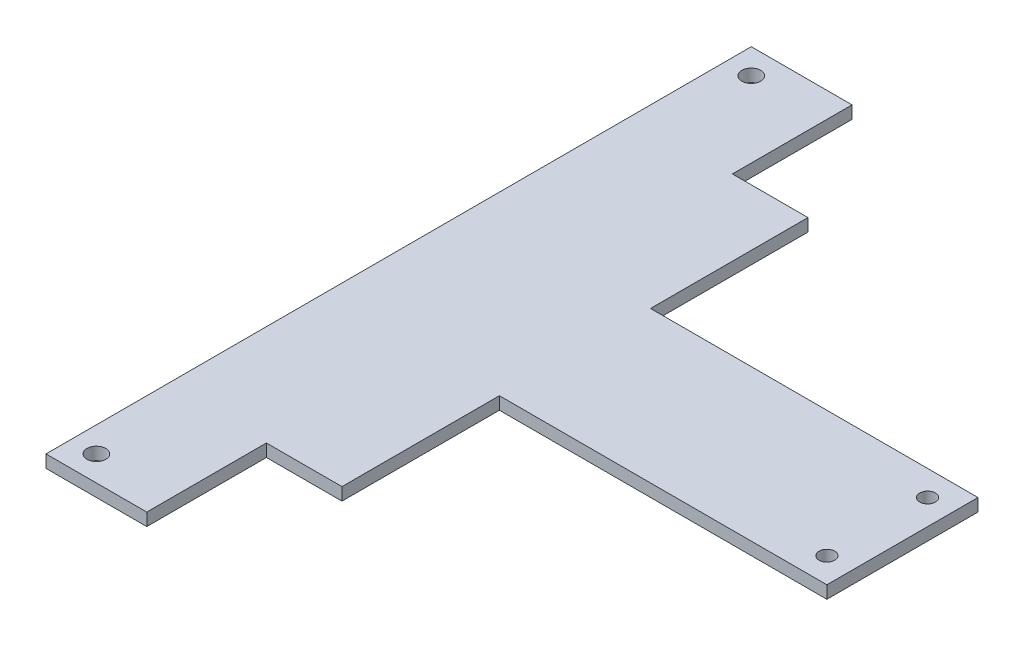
ISO-10303-21;
HEADER;
FILE_DESCRIPTION(('STEP AP214'),'2;1');
FILE_NAME('part.step','',(''),(''),'','','');
FILE_SCHEMA(('AUTOMOTIVE_DESIGN { 1 0 10303 214 1 1 1 1 }'));
ENDSEC;
DATA;
#1=APPLICATION_CONTEXT('core data for automotive mechanical design processes');
#2=APPLICATION_PROTOCOL_DEFINITION('international standard','automotive_design',2000,#1);
#3=PRODUCT_CONTEXT('',#1,'mechanical');
#4=PRODUCT('Part','Part','',(#3));
#5=PRODUCT_RELATED_PRODUCT_CATEGORY('part','',(#4));
#6=PRODUCT_DEFINITION_FORMATION('','',#4);
#7=PRODUCT_DEFINITION_CONTEXT('part definition',#1,'design');
#8=PRODUCT_DEFINITION('design','',#6,#7);
#9=PRODUCT_DEFINITION_SHAPE('','',#8);
#10=(LENGTH_UNIT() NAMED_UNIT(*) SI_UNIT(.MILLI.,.METRE.));
#11=(NAMED_UNIT(*) PLANE_ANGLE_UNIT() SI_UNIT($,.RADIAN.));
#12=(NAMED_UNIT(*) SI_UNIT($,.STERADIAN.) SOLID_ANGLE_UNIT());
#13=UNCERTAINTY_MEASURE_WITH_UNIT(LENGTH_MEASURE(1.E-05),#10,'distance_accuracy_value','');
#14=(GEOMETRIC_REPRESENTATION_CONTEXT(3) GLOBAL_UNCERTAINTY_ASSIGNED_CONTEXT((#13)) GLOBAL_UNIT_ASSIGNED_CONTEXT((#10,
#11,#12)) REPRESENTATION_CONTEXT('',''));
#15=CARTESIAN_POINT('',(0.,0.,0.));
#16=DIRECTION('',(0.,0.,1.));
#17=DIRECTION('',(1.,0.,0.));
#18=AXIS2_PLACEMENT_3D('',#15,#16,#17);
#19=CARTESIAN_POINT('',(203.2,3.175,0.));
#20=DIRECTION('',(-1.,0.,0.));
#21=DIRECTION('',(0.,0.,1.));
#22=AXIS2_PLACEMENT_3D('',#19,#20,#21);
#23=PLANE('',#22);
#24=DIRECTION('',(0.,0.,-1.));
#25=VECTOR('',#24,1.);
#26=CARTESIAN_POINT('',(203.2,-3.175,0.));
#27=LINE('',#26,#25);
#28=CARTESIAN_POINT('',(203.2,-3.175,38.1));
#29=VERTEX_POINT('',#28);
#30=CARTESIAN_POINT('',(203.2,-3.175,-38.1));
#31=VERTEX_POINT('',#30);
#32=EDGE_CURVE('E160',#29,#31,#27,.T.);
#33=ORIENTED_EDGE('',*,*,#32,.T.);
#34=DIRECTION('',(0.,-1.,0.));
#35=VECTOR('',#34,1.);
#36=CARTESIAN_POINT('',(203.2,3.175,-38.1));
#37=LINE('',#36,#35);
#38=CARTESIAN_POINT('',(203.2,3.175,-38.1));
#39=VERTEX_POINT('',#38);
#40=EDGE_CURVE('E11',#39,#31,#37,.T.);
#41=ORIENTED_EDGE('',*,*,#40,.F.);
#42=DIRECTION('',(0.,0.,-1.));
#43=VECTOR('',#42,1.);
#44=CARTESIAN_POINT('',(203.2,3.175,0.));
#45=LINE('',#44,#43);
#46=CARTESIAN_POINT('',(203.2,3.175,38.1));
#47=VERTEX_POINT('',#46);
#48=EDGE_CURVE('E178',#47,#39,#45,.T.);
#49=ORIENTED_EDGE('',*,*,#48,.F.);
#50=DIRECTION('',(0.,-1.,0.));
#51=VECTOR('',#50,1.);
#52=CARTESIAN_POINT('',(203.2,3.175,38.1));
#53=LINE('',#52,#51);
#54=EDGE_CURVE('E154',#47,#29,#53,.T.);
#55=ORIENTED_EDGE('',*,*,#54,.T.);
#56=EDGE_LOOP('',(#33,#41,#49,#55));
#57=FACE_BOUND('',#56,.T.);
#58=ADVANCED_FACE('F35',(#57),#23,.F.);
#59=CARTESIAN_POINT('',(0.,3.175,-38.1));
#60=DIRECTION('',(0.,0.,1.));
#61=DIRECTION('',(1.,0.,0.));
#62=AXIS2_PLACEMENT_3D('',#59,#60,#61);
#63=PLANE('',#62);
#64=DIRECTION('',(-1.,0.,0.));
#65=VECTOR('',#64,1.);
#66=CARTESIAN_POINT('',(0.,-3.175,-38.1));
#67=LINE('',#66,#65);
#68=CARTESIAN_POINT('',(38.1,-3.175,-38.1));
#69=VERTEX_POINT('',#68);
#70=EDGE_CURVE('E163',#31,#69,#67,.T.);
#71=ORIENTED_EDGE('',*,*,#70,.T.);
#72=DIRECTION('',(0.,-1.,0.));
#73=VECTOR('',#72,1.);
#74=CARTESIAN_POINT('',(38.1,3.175,-38.1));
#75=LINE('',#74,#73);
#76=CARTESIAN_POINT('',(38.1,3.175,-38.1));
#77=VERTEX_POINT('',#76);
#78=EDGE_CURVE('E42',#77,#69,#75,.T.);
#79=ORIENTED_EDGE('',*,*,#78,.F.);
#80=DIRECTION('',(-1.,0.,0.));
#81=VECTOR('',#80,1.);
#82=CARTESIAN_POINT('',(0.,3.175,-38.1));
#83=LINE('',#82,#81);
#84=EDGE_CURVE('E253',#39,#77,#83,.T.);
#85=ORIENTED_EDGE('',*,*,#84,.F.);
#86=ORIENTED_EDGE('',*,*,#40,.T.);
#87=EDGE_LOOP('',(#71,#79,#85,#86));
#88=FACE_BOUND('',#87,.T.);
#89=ADVANCED_FACE('F190',(#88),#63,.F.);
#90=CARTESIAN_POINT('',(38.1,3.175,0.));
#91=DIRECTION('',(1.,0.,0.));
#92=DIRECTION('',(0.,0.,-1.));
#93=AXIS2_PLACEMENT_3D('',#90,#91,#92);
#94=PLANE('',#93);
#95=DIRECTION('',(0.,-1.,0.));
#96=VECTOR('',#95,1.);
#97=CARTESIAN_POINT('',(38.1000000000001,3.176,-117.475));
#98=LINE('',#97,#96);
#99=CARTESIAN_POINT('',(38.1,3.175,-117.475));
#100=VERTEX_POINT('',#99);
#101=CARTESIAN_POINT('',(38.1,-3.175,-117.475));
#102=VERTEX_POINT('',#101);
#103=EDGE_CURVE('E49',#100,#102,#98,.T.);
#104=ORIENTED_EDGE('',*,*,#103,.F.);
#105=DIRECTION('',(0.,0.,1.));
#106=VECTOR('',#105,1.);
#107=CARTESIAN_POINT('',(38.1,3.175,0.));
#108=LINE('',#107,#106);
#109=EDGE_CURVE('E187',#100,#77,#108,.T.);
#110=ORIENTED_EDGE('',*,*,#109,.T.);
#111=ORIENTED_EDGE('',*,*,#78,.T.);
#112=DIRECTION('',(0.,0.,1.));
#113=VECTOR('',#112,1.);
#114=CARTESIAN_POINT('',(38.1,-3.175,0.));
#115=LINE('',#114,#113);
#116=EDGE_CURVE('E167',#102,#69,#115,.T.);
#117=ORIENTED_EDGE('',*,*,#116,.F.);
#118=EDGE_LOOP('',(#104,#110,#111,#117));
#119=FACE_BOUND('',#118,.T.);
#120=ADVANCED_FACE('F185',(#119),#94,.T.);
#121=CARTESIAN_POINT('',(1.29526019539602E-13,3.175,-177.8));
#122=DIRECTION('',(0.,0.,-1.));
#123=DIRECTION('',(-1.,0.,0.));
#124=AXIS2_PLACEMENT_3D('',#121,#122,#123);
#125=PLANE('',#124);
#126=DIRECTION('',(0.,-1.,0.));
#127=VECTOR('',#126,1.);
#128=CARTESIAN_POINT('',(0.,3.176,-177.8));
#129=LINE('',#128,#127);
#130=CARTESIAN_POINT('',(0.,3.175,-177.8));
#131=VERTEX_POINT('',#130);
#132=CARTESIAN_POINT('',(0.,-3.175,-177.8));
#133=VERTEX_POINT('',#132);
#134=EDGE_CURVE('E208',#131,#133,#129,.T.);
#135=ORIENTED_EDGE('',*,*,#134,.T.);
#136=DIRECTION('',(1.,0.,0.));
#137=VECTOR('',#136,1.);
#138=CARTESIAN_POINT('',(1.29526019539602E-13,-3.175,-177.8));
#139=LINE('',#138,#137);
#140=CARTESIAN_POINT('',(-50.8,-3.175,-177.8));
#141=VERTEX_POINT('',#140);
#142=EDGE_CURVE('E169',#141,#133,#139,.T.);
#143=ORIENTED_EDGE('',*,*,#142,.F.);
#144=DIRECTION('',(0.,-1.,0.));
#145=VECTOR('',#144,1.);
#146=CARTESIAN_POINT('',(-50.8,3.175,-177.8));
#147=LINE('',#146,#145);
#148=CARTESIAN_POINT('',(-50.8,3.175,-177.8));
#149=VERTEX_POINT('',#148);
#150=EDGE_CURVE('E235',#149,#141,#147,.T.);
#151=ORIENTED_EDGE('',*,*,#150,.F.);
#152=DIRECTION('',(1.,0.,0.));
#153=VECTOR('',#152,1.);
#154=CARTESIAN_POINT('',(1.29526019539602E-13,3.175,-177.8));
#155=LINE('',#154,#153);
#156=EDGE_CURVE('E156',#149,#131,#155,.T.);
#157=ORIENTED_EDGE('',*,*,#156,.T.);
#158=EDGE_LOOP('',(#135,#143,#151,#157));
#159=FACE_BOUND('',#158,.T.);
#160=ADVANCED_FACE('F258',(#159),#125,.T.);
#161=CARTESIAN_POINT('',(1.29526019539602E-13,3.175,177.8));
#162=DIRECTION('',(0.,0.,1.));
#163=DIRECTION('',(1.,0.,0.));
#164=AXIS2_PLACEMENT_3D('',#161,#162,#163);
#165=PLANE('',#164);
#166=DIRECTION('',(0.,-1.,0.));
#167=VECTOR('',#166,1.);
#168=CARTESIAN_POINT('',(0.,3.176,177.8));
#169=LINE('',#168,#167);
#170=CARTESIAN_POINT('',(0.,3.175,177.8));
#171=VERTEX_POINT('',#170);
#172=CARTESIAN_POINT('',(0.,-3.175,177.8));
#173=VERTEX_POINT('',#172);
#174=EDGE_CURVE('E57',#171,#173,#169,.T.);
#175=ORIENTED_EDGE('',*,*,#174,.F.);
#176=DIRECTION('',(-1.,0.,0.));
#177=VECTOR('',#176,1.);
#178=CARTESIAN_POINT('',(1.29526019539602E-13,3.175,177.8));
#179=LINE('',#178,#177);
#180=CARTESIAN_POINT('',(-50.8,3.175,177.8));
#181=VERTEX_POINT('',#180);
#182=EDGE_CURVE('E152',#171,#181,#179,.T.);
#183=ORIENTED_EDGE('',*,*,#182,.T.);
#184=DIRECTION('',(0.,-1.,0.));
#185=VECTOR('',#184,1.);
#186=CARTESIAN_POINT('',(-50.8,3.175,177.8));
#187=LINE('',#186,#185);
#188=CARTESIAN_POINT('',(-50.8,-3.175,177.8));
#189=VERTEX_POINT('',#188);
#190=EDGE_CURVE('E232',#181,#189,#187,.T.);
#191=ORIENTED_EDGE('',*,*,#190,.T.);
#192=DIRECTION('',(-1.,0.,0.));
#193=VECTOR('',#192,1.);
#194=CARTESIAN_POINT('',(1.29526019539602E-13,-3.175,177.8));
#195=LINE('',#194,#193);
#196=EDGE_CURVE('E172',#173,#189,#195,.T.);
#197=ORIENTED_EDGE('',*,*,#196,.F.);
#198=EDGE_LOOP('',(#175,#183,#191,#197));
#199=FACE_BOUND('',#198,.T.);
#200=ADVANCED_FACE('F291',(#199),#165,.T.);
#201=CARTESIAN_POINT('',(38.1,3.175,0.));
#202=DIRECTION('',(1.,0.,0.));
#203=DIRECTION('',(0.,0.,-1.));
#204=AXIS2_PLACEMENT_3D('',#201,#202,#203);
#205=PLANE('',#204);
#206=DIRECTION('',(0.,-1.,0.));
#207=VECTOR('',#206,1.);
#208=CARTESIAN_POINT('',(38.1,3.176,117.475));
#209=LINE('',#208,#207);
#210=CARTESIAN_POINT('',(38.1,3.175,117.475));
#211=VERTEX_POINT('',#210);
#212=CARTESIAN_POINT('',(38.1,-3.175,117.475));
#213=VERTEX_POINT('',#212);
#214=EDGE_CURVE('E124',#211,#213,#209,.T.);
#215=ORIENTED_EDGE('',*,*,#214,.T.);
#216=DIRECTION('',(0.,0.,1.));
#217=VECTOR('',#216,1.);
#218=CARTESIAN_POINT('',(38.1,-3.175,0.));
#219=LINE('',#218,#217);
#220=CARTESIAN_POINT('',(38.1,-3.175,38.1));
#221=VERTEX_POINT('',#220);
#222=EDGE_CURVE('E174',#221,#213,#219,.T.);
#223=ORIENTED_EDGE('',*,*,#222,.F.);
#224=DIRECTION('',(0.,-1.,0.));
#225=VECTOR('',#224,1.);
#226=CARTESIAN_POINT('',(38.1,3.175,38.1));
#227=LINE('',#226,#225);
#228=CARTESIAN_POINT('',(38.1,3.175,38.1));
#229=VERTEX_POINT('',#228);
#230=EDGE_CURVE('E149',#229,#221,#227,.T.);
#231=ORIENTED_EDGE('',*,*,#230,.F.);
#232=DIRECTION('',(0.,0.,1.));
#233=VECTOR('',#232,1.);
#234=CARTESIAN_POINT('',(38.1,3.175,0.));
#235=LINE('',#234,#233);
#236=EDGE_CURVE('E143',#229,#211,#235,.T.);
#237=ORIENTED_EDGE('',*,*,#236,.T.);
#238=EDGE_LOOP('',(#215,#223,#231,#237));
#239=FACE_BOUND('',#238,.T.);
#240=ADVANCED_FACE('F148',(#239),#205,.T.);
#241=CARTESIAN_POINT('',(0.,3.175,38.1));
#242=DIRECTION('',(0.,0.,-1.));
#243=DIRECTION('',(-1.,0.,0.));
#244=AXIS2_PLACEMENT_3D('',#241,#242,#243);
#245=PLANE('',#244);
#246=DIRECTION('',(1.,0.,0.));
#247=VECTOR('',#246,1.);
#248=CARTESIAN_POINT('',(0.,-3.175,38.1));
#249=LINE('',#248,#247);
#250=EDGE_CURVE('E176',#221,#29,#249,.T.);
#251=ORIENTED_EDGE('',*,*,#250,.T.);
#252=ORIENTED_EDGE('',*,*,#54,.F.);
#253=DIRECTION('',(1.,0.,0.));
#254=VECTOR('',#253,1.);
#255=CARTESIAN_POINT('',(0.,3.175,38.1));
#256=LINE('',#255,#254);
#257=EDGE_CURVE('E151',#229,#47,#256,.T.);
#258=ORIENTED_EDGE('',*,*,#257,.F.);
#259=ORIENTED_EDGE('',*,*,#230,.T.);
#260=EDGE_LOOP('',(#251,#252,#258,#259));
#261=FACE_BOUND('',#260,.T.);
#262=ADVANCED_FACE('F267',(#261),#245,.F.);
#263=CARTESIAN_POINT('',(0.,3.175,0.));
#264=DIRECTION('',(0.,1.,0.));
#265=DIRECTION('',(0.,0.,1.));
#266=AXIS2_PLACEMENT_3D('',#263,#264,#265);
#267=PLANE('',#266);
#268=DIRECTION('',(1.,0.,0.));
#269=VECTOR('',#268,1.);
#270=CARTESIAN_POINT('',(38.1,3.175,117.475));
#271=LINE('',#270,#269);
#272=CARTESIAN_POINT('',(0.,3.175,117.475));
#273=VERTEX_POINT('',#272);
#274=EDGE_CURVE('E127',#273,#211,#271,.T.);
#275=ORIENTED_EDGE('',*,*,#274,.T.);
#276=ORIENTED_EDGE('',*,*,#236,.F.);
#277=ORIENTED_EDGE('',*,*,#257,.T.);
#278=ORIENTED_EDGE('',*,*,#48,.T.);
#279=ORIENTED_EDGE('',*,*,#84,.T.);
#280=ORIENTED_EDGE('',*,*,#109,.F.);
#281=DIRECTION('',(-1.,0.,0.));
#282=VECTOR('',#281,1.);
#283=CARTESIAN_POINT('',(38.1000000000001,3.175,-117.475));
#284=LINE('',#283,#282);
#285=CARTESIAN_POINT('',(0.,3.175,-117.475));
#286=VERTEX_POINT('',#285);
#287=EDGE_CURVE('E211',#100,#286,#284,.T.);
#288=ORIENTED_EDGE('',*,*,#287,.T.);
#289=DIRECTION('',(0.,0.,-1.));
#290=VECTOR('',#289,1.);
#291=CARTESIAN_POINT('',(0.,3.175,-177.8));
#292=LINE('',#291,#290);
#293=EDGE_CURVE('E201',#286,#131,#292,.T.);
#294=ORIENTED_EDGE('',*,*,#293,.T.);
#295=ORIENTED_EDGE('',*,*,#156,.F.);
#296=DIRECTION('',(0.,0.,-1.));
#297=VECTOR('',#296,1.);
#298=CARTESIAN_POINT('',(-50.8,3.175,177.8));
#299=LINE('',#298,#297);
#300=EDGE_CURVE('E229',#181,#149,#299,.T.);
#301=ORIENTED_EDGE('',*,*,#300,.F.);
#302=ORIENTED_EDGE('',*,*,#182,.F.);
#303=DIRECTION('',(0.,0.,-1.));
#304=VECTOR('',#303,1.);
#305=CARTESIAN_POINT('',(0.,3.175,177.8));
#306=LINE('',#305,#304);
#307=EDGE_CURVE('E145',#171,#273,#306,.T.);
#308=ORIENTED_EDGE('',*,*,#307,.T.);
#309=EDGE_LOOP('',(#275,#276,#277,#278,#279,#280,#288,#294,#295,#301,#302,#308));
#310=FACE_BOUND('',#309,.T.);
#311=CARTESIAN_POINT('',(190.5,3.175,-25.4));
#312=DIRECTION('',(0.,1.,0.));
#313=DIRECTION('',(0.,0.,1.));
#314=AXIS2_PLACEMENT_3D('',#311,#312,#313);
#315=CIRCLE('',#314,3.96874999999999);
#316=CARTESIAN_POINT('',(190.5,3.175,-21.43125));
#317=VERTEX_POINT('',#316);
#318=EDGE_CURVE('E238',#317,#317,#315,.T.);
#319=ORIENTED_EDGE('',*,*,#318,.F.);
#320=EDGE_LOOP('',(#319));
#321=FACE_BOUND('',#320,.T.);
#322=CARTESIAN_POINT('',(190.5,3.175,25.4));
#323=DIRECTION('',(0.,1.,0.));
#324=DIRECTION('',(0.,0.,1.));
#325=AXIS2_PLACEMENT_3D('',#322,#323,#324);
#326=CIRCLE('',#325,3.96874999999999);
#327=CARTESIAN_POINT('',(190.5,3.175,29.36875));
#328=VERTEX_POINT('',#327);
#329=EDGE_CURVE('E246',#328,#328,#326,.T.);
#330=ORIENTED_EDGE('',*,*,#329,.F.);
#331=EDGE_LOOP('',(#330));
#332=FACE_BOUND('',#331,.T.);
#333=CARTESIAN_POINT('',(-38.1,3.175,165.1));
#334=DIRECTION('',(0.,-1.,0.));
#335=DIRECTION('',(0.,0.,-1.));
#336=AXIS2_PLACEMENT_3D('',#333,#334,#335);
#337=CIRCLE('',#336,4.7625);
#338=CARTESIAN_POINT('',(-38.1,3.175,160.3375));
#339=VERTEX_POINT('',#338);
#340=EDGE_CURVE('E217',#339,#339,#337,.T.);
#341=ORIENTED_EDGE('',*,*,#340,.T.);
#342=EDGE_LOOP('',(#341));
#343=FACE_BOUND('',#342,.T.);
#344=CARTESIAN_POINT('',(-38.1,3.175,-165.1));
#345=DIRECTION('',(0.,-1.,0.));
#346=DIRECTION('',(0.,0.,-1.));
#347=AXIS2_PLACEMENT_3D('',#344,#345,#346);
#348=CIRCLE('',#347,4.7625);
#349=CARTESIAN_POINT('',(-38.1,3.175,-169.8625));
#350=VERTEX_POINT('',#349);
#351=EDGE_CURVE('E223',#350,#350,#348,.T.);
#352=ORIENTED_EDGE('',*,*,#351,.T.);
#353=EDGE_LOOP('',(#352));
#354=FACE_BOUND('',#353,.T.);
#355=ADVANCED_FACE('F141',(#310,#321,#332,#343,#354),#267,.T.);
#356=CARTESIAN_POINT('',(0.,-3.175,0.));
#357=DIRECTION('',(0.,1.,0.));
#358=DIRECTION('',(0.,0.,1.));
#359=AXIS2_PLACEMENT_3D('',#356,#357,#358);
#360=PLANE('',#359);
#361=CARTESIAN_POINT('',(190.5,-3.175,-25.4));
#362=DIRECTION('',(0.,1.,0.));
#363=DIRECTION('',(0.,0.,1.));
#364=AXIS2_PLACEMENT_3D('',#361,#362,#363);
#365=CIRCLE('',#364,3.96874999999999);
#366=CARTESIAN_POINT('',(190.5,-3.175,-21.43125));
#367=VERTEX_POINT('',#366);
#368=EDGE_CURVE('E243',#367,#367,#365,.T.);
#369=ORIENTED_EDGE('',*,*,#368,.T.);
#370=EDGE_LOOP('',(#369));
#371=FACE_BOUND('',#370,.T.);
#372=CARTESIAN_POINT('',(190.5,-3.175,25.4));
#373=DIRECTION('',(0.,1.,0.));
#374=DIRECTION('',(0.,0.,1.));
#375=AXIS2_PLACEMENT_3D('',#372,#373,#374);
#376=CIRCLE('',#375,3.96874999999999);
#377=CARTESIAN_POINT('',(190.5,-3.175,29.36875));
#378=VERTEX_POINT('',#377);
#379=EDGE_CURVE('E164',#378,#378,#376,.T.);
#380=ORIENTED_EDGE('',*,*,#379,.T.);
#381=EDGE_LOOP('',(#380));
#382=FACE_BOUND('',#381,.T.);
#383=ORIENTED_EDGE('',*,*,#222,.T.);
#384=DIRECTION('',(1.,0.,0.));
#385=VECTOR('',#384,1.);
#386=CARTESIAN_POINT('',(38.1,-3.175,117.475));
#387=LINE('',#386,#385);
#388=CARTESIAN_POINT('',(0.,-3.175,117.475));
#389=VERTEX_POINT('',#388);
#390=EDGE_CURVE('E130',#389,#213,#387,.T.);
#391=ORIENTED_EDGE('',*,*,#390,.F.);
#392=DIRECTION('',(0.,0.,-1.));
#393=VECTOR('',#392,1.);
#394=CARTESIAN_POINT('',(0.,-3.175,177.8));
#395=LINE('',#394,#393);
#396=EDGE_CURVE('E146',#173,#389,#395,.T.);
#397=ORIENTED_EDGE('',*,*,#396,.F.);
#398=ORIENTED_EDGE('',*,*,#196,.T.);
#399=DIRECTION('',(0.,0.,-1.));
#400=VECTOR('',#399,1.);
#401=CARTESIAN_POINT('',(-50.8,-3.175,177.8));
#402=LINE('',#401,#400);
#403=EDGE_CURVE('E226',#189,#141,#402,.T.);
#404=ORIENTED_EDGE('',*,*,#403,.T.);
#405=ORIENTED_EDGE('',*,*,#142,.T.);
#406=DIRECTION('',(0.,0.,-1.));
#407=VECTOR('',#406,1.);
#408=CARTESIAN_POINT('',(0.,-3.175,-177.8));
#409=LINE('',#408,#407);
#410=CARTESIAN_POINT('',(0.,-3.175,-117.475));
#411=VERTEX_POINT('',#410);
#412=EDGE_CURVE('E199',#411,#133,#409,.T.);
#413=ORIENTED_EDGE('',*,*,#412,.F.);
#414=DIRECTION('',(-1.,0.,0.));
#415=VECTOR('',#414,1.);
#416=CARTESIAN_POINT('',(38.1000000000001,-3.175,-117.475));
#417=LINE('',#416,#415);
#418=EDGE_CURVE('E198',#102,#411,#417,.T.);
#419=ORIENTED_EDGE('',*,*,#418,.F.);
#420=ORIENTED_EDGE('',*,*,#116,.T.);
#421=ORIENTED_EDGE('',*,*,#70,.F.);
#422=ORIENTED_EDGE('',*,*,#32,.F.);
#423=ORIENTED_EDGE('',*,*,#250,.F.);
#424=EDGE_LOOP('',(#383,#391,#397,#398,#404,#405,#413,#419,#420,#421,#422,#423));
#425=FACE_BOUND('',#424,.T.);
#426=CARTESIAN_POINT('',(-38.1,-3.175,165.1));
#427=DIRECTION('',(0.,-1.,0.));
#428=DIRECTION('',(0.,0.,-1.));
#429=AXIS2_PLACEMENT_3D('',#426,#427,#428);
#430=CIRCLE('',#429,4.7625);
#431=CARTESIAN_POINT('',(-38.1,-3.175,160.3375));
#432=VERTEX_POINT('',#431);
#433=EDGE_CURVE('E135',#432,#432,#430,.T.);
#434=ORIENTED_EDGE('',*,*,#433,.F.);
#435=EDGE_LOOP('',(#434));
#436=FACE_BOUND('',#435,.T.);
#437=CARTESIAN_POINT('',(-38.1,-3.175,-165.1));
#438=DIRECTION('',(0.,-1.,0.));
#439=DIRECTION('',(0.,0.,-1.));
#440=AXIS2_PLACEMENT_3D('',#437,#438,#439);
#441=CIRCLE('',#440,4.7625);
#442=CARTESIAN_POINT('',(-38.1,-3.175,-169.8625));
#443=VERTEX_POINT('',#442);
#444=EDGE_CURVE('E220',#443,#443,#441,.T.);
#445=ORIENTED_EDGE('',*,*,#444,.F.);
#446=EDGE_LOOP('',(#445));
#447=FACE_BOUND('',#446,.T.);
#448=ADVANCED_FACE('F194',(#371,#382,#425,#436,#447),#360,.F.);
#449=CARTESIAN_POINT('',(190.5,3.175,25.4));
#450=DIRECTION('',(0.,1.,0.));
#451=DIRECTION('',(0.,0.,1.));
#452=AXIS2_PLACEMENT_3D('',#449,#450,#451);
#453=CYLINDRICAL_SURFACE('',#452,3.96874999999999);
#454=ORIENTED_EDGE('',*,*,#379,.F.);
#455=EDGE_LOOP('',(#454));
#456=FACE_BOUND('',#455,.T.);
#457=ORIENTED_EDGE('',*,*,#329,.T.);
#458=EDGE_LOOP('',(#457));
#459=FACE_BOUND('',#458,.T.);
#460=ADVANCED_FACE('F301',(#456,#459),#453,.F.);
#461=CARTESIAN_POINT('',(190.5,3.175,-25.4));
#462=DIRECTION('',(0.,1.,0.));
#463=DIRECTION('',(0.,0.,1.));
#464=AXIS2_PLACEMENT_3D('',#461,#462,#463);
#465=CYLINDRICAL_SURFACE('',#464,3.96874999999999);
#466=ORIENTED_EDGE('',*,*,#368,.F.);
#467=EDGE_LOOP('',(#466));
#468=FACE_BOUND('',#467,.T.);
#469=ORIENTED_EDGE('',*,*,#318,.T.);
#470=EDGE_LOOP('',(#469));
#471=FACE_BOUND('',#470,.T.);
#472=ADVANCED_FACE('F307',(#468,#471),#465,.F.);
#473=CARTESIAN_POINT('',(-50.8,3.175,177.8));
#474=DIRECTION('',(-1.,0.,0.));
#475=DIRECTION('',(0.,0.,1.));
#476=AXIS2_PLACEMENT_3D('',#473,#474,#475);
#477=PLANE('',#476);
#478=ORIENTED_EDGE('',*,*,#403,.F.);
#479=ORIENTED_EDGE('',*,*,#190,.F.);
#480=ORIENTED_EDGE('',*,*,#300,.T.);
#481=ORIENTED_EDGE('',*,*,#150,.T.);
#482=EDGE_LOOP('',(#478,#479,#480,#481));
#483=FACE_BOUND('',#482,.T.);
#484=ADVANCED_FACE('F311',(#483),#477,.T.);
#485=CARTESIAN_POINT('',(-38.1,3.175,-165.1));
#486=DIRECTION('',(0.,-1.,0.));
#487=DIRECTION('',(0.,0.,-1.));
#488=AXIS2_PLACEMENT_3D('',#485,#486,#487);
#489=CYLINDRICAL_SURFACE('',#488,4.7625);
#490=ORIENTED_EDGE('',*,*,#351,.F.);
#491=EDGE_LOOP('',(#490));
#492=FACE_BOUND('',#491,.T.);
#493=ORIENTED_EDGE('',*,*,#444,.T.);
#494=EDGE_LOOP('',(#493));
#495=FACE_BOUND('',#494,.T.);
#496=ADVANCED_FACE('F315',(#492,#495),#489,.F.);
#497=CARTESIAN_POINT('',(-38.1,3.175,165.1));
#498=DIRECTION('',(0.,-1.,0.));
#499=DIRECTION('',(0.,0.,-1.));
#500=AXIS2_PLACEMENT_3D('',#497,#498,#499);
#501=CYLINDRICAL_SURFACE('',#500,4.7625);
#502=ORIENTED_EDGE('',*,*,#340,.F.);
#503=EDGE_LOOP('',(#502));
#504=FACE_BOUND('',#503,.T.);
#505=ORIENTED_EDGE('',*,*,#433,.T.);
#506=EDGE_LOOP('',(#505));
#507=FACE_BOUND('',#506,.T.);
#508=ADVANCED_FACE('F319',(#504,#507),#501,.F.);
#509=CARTESIAN_POINT('',(0.,3.176,-177.8));
#510=DIRECTION('',(-1.,0.,0.));
#511=DIRECTION('',(0.,0.,1.));
#512=AXIS2_PLACEMENT_3D('',#509,#510,#511);
#513=PLANE('',#512);
#514=DIRECTION('',(0.,-1.,0.));
#515=VECTOR('',#514,1.);
#516=CARTESIAN_POINT('',(0.,3.176,-117.475));
#517=LINE('',#516,#515);
#518=EDGE_CURVE('E212',#286,#411,#517,.T.);
#519=ORIENTED_EDGE('',*,*,#518,.T.);
#520=ORIENTED_EDGE('',*,*,#412,.T.);
#521=ORIENTED_EDGE('',*,*,#134,.F.);
#522=ORIENTED_EDGE('',*,*,#293,.F.);
#523=EDGE_LOOP('',(#519,#520,#521,#522));
#524=FACE_BOUND('',#523,.T.);
#525=ADVANCED_FACE('F261',(#524),#513,.F.);
#526=CARTESIAN_POINT('',(38.1000000000001,3.176,-117.475));
#527=DIRECTION('',(0.,0.,1.));
#528=DIRECTION('',(1.,0.,0.));
#529=AXIS2_PLACEMENT_3D('',#526,#527,#528);
#530=PLANE('',#529);
#531=ORIENTED_EDGE('',*,*,#103,.T.);
#532=ORIENTED_EDGE('',*,*,#418,.T.);
#533=ORIENTED_EDGE('',*,*,#518,.F.);
#534=ORIENTED_EDGE('',*,*,#287,.F.);
#535=EDGE_LOOP('',(#531,#532,#533,#534));
#536=FACE_BOUND('',#535,.T.);
#537=ADVANCED_FACE('F262',(#536),#530,.F.);
#538=CARTESIAN_POINT('',(38.1,3.176,117.475));
#539=DIRECTION('',(0.,0.,-1.));
#540=DIRECTION('',(-1.,0.,0.));
#541=AXIS2_PLACEMENT_3D('',#538,#539,#540);
#542=PLANE('',#541);
#543=DIRECTION('',(0.,-1.,0.));
#544=VECTOR('',#543,1.);
#545=CARTESIAN_POINT('',(0.,3.176,117.475));
#546=LINE('',#545,#544);
#547=EDGE_CURVE('E136',#273,#389,#546,.T.);
#548=ORIENTED_EDGE('',*,*,#547,.T.);
#549=ORIENTED_EDGE('',*,*,#390,.T.);
#550=ORIENTED_EDGE('',*,*,#214,.F.);
#551=ORIENTED_EDGE('',*,*,#274,.F.);
#552=EDGE_LOOP('',(#548,#549,#550,#551));
#553=FACE_BOUND('',#552,.T.);
#554=ADVANCED_FACE('F126',(#553),#542,.F.);
#555=CARTESIAN_POINT('',(0.,3.176,177.8));
#556=DIRECTION('',(-1.,0.,0.));
#557=DIRECTION('',(0.,0.,1.));
#558=AXIS2_PLACEMENT_3D('',#555,#556,#557);
#559=PLANE('',#558);
#560=ORIENTED_EDGE('',*,*,#174,.T.);
#561=ORIENTED_EDGE('',*,*,#396,.T.);
#562=ORIENTED_EDGE('',*,*,#547,.F.);
#563=ORIENTED_EDGE('',*,*,#307,.F.);
#564=EDGE_LOOP('',(#560,#561,#562,#563));
#565=FACE_BOUND('',#564,.T.);
#566=ADVANCED_FACE('F272',(#565),#559,.F.);
#567=CLOSED_SHELL('',(#58,#89,#120,#160,#200,#240,#262,#355,#448,#460,#472,#484,#496,#508,#525,
#537,#554,#566));
#568=MANIFOLD_SOLID_BREP('B2',#567);
#569=ADVANCED_BREP_SHAPE_REPRESENTATION('',(#18,#568),#14);
#570=SHAPE_DEFINITION_REPRESENTATION(#9,#569);
ENDSEC;
END-ISO-10303-21;
